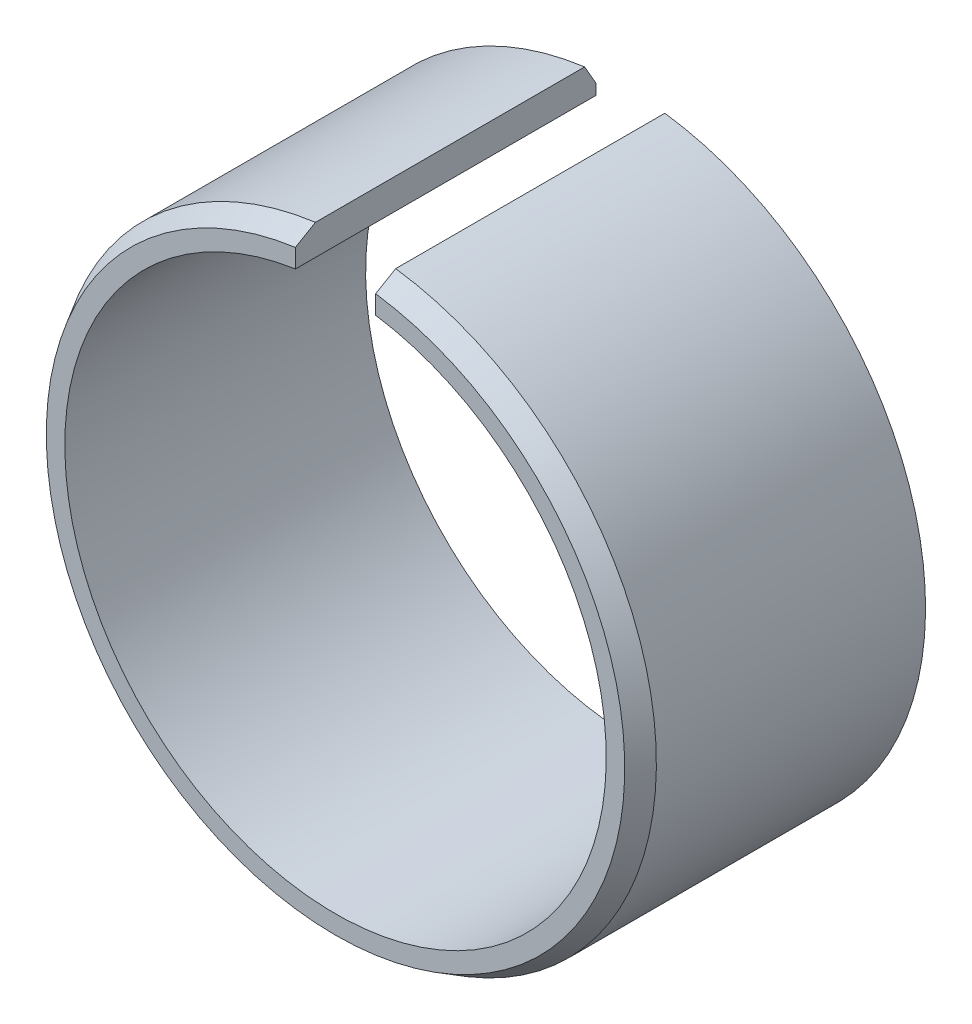
ISO-10303-21;
HEADER;
FILE_DESCRIPTION(('STEP AP214'),'2;1');
FILE_NAME('part.step','',(''),(''),'','','');
FILE_SCHEMA(('AUTOMOTIVE_DESIGN { 1 0 10303 214 1 1 1 1 }'));
ENDSEC;
DATA;
#1=APPLICATION_CONTEXT('core data for automotive mechanical design processes');
#2=APPLICATION_PROTOCOL_DEFINITION('international standard','automotive_design',2000,#1);
#3=PRODUCT_CONTEXT('',#1,'mechanical');
#4=PRODUCT('Part','Part','',(#3));
#5=PRODUCT_RELATED_PRODUCT_CATEGORY('part','',(#4));
#6=PRODUCT_DEFINITION_FORMATION('','',#4);
#7=PRODUCT_DEFINITION_CONTEXT('part definition',#1,'design');
#8=PRODUCT_DEFINITION('design','',#6,#7);
#9=PRODUCT_DEFINITION_SHAPE('','',#8);
#10=(LENGTH_UNIT() NAMED_UNIT(*) SI_UNIT(.MILLI.,.METRE.));
#11=(NAMED_UNIT(*) PLANE_ANGLE_UNIT() SI_UNIT($,.RADIAN.));
#12=(NAMED_UNIT(*) SI_UNIT($,.STERADIAN.) SOLID_ANGLE_UNIT());
#13=UNCERTAINTY_MEASURE_WITH_UNIT(LENGTH_MEASURE(1.E-05),#10,'distance_accuracy_value','');
#14=(GEOMETRIC_REPRESENTATION_CONTEXT(3) GLOBAL_UNCERTAINTY_ASSIGNED_CONTEXT((#13)) GLOBAL_UNIT_ASSIGNED_CONTEXT((#10,
#11,#12)) REPRESENTATION_CONTEXT('',''));
#15=CARTESIAN_POINT('',(0.,0.,0.));
#16=DIRECTION('',(0.,0.,1.));
#17=DIRECTION('',(1.,0.,0.));
#18=AXIS2_PLACEMENT_3D('',#15,#16,#17);
#19=CARTESIAN_POINT('',(0.,0.,15.));
#20=DIRECTION('',(0.,0.,-1.));
#21=DIRECTION('',(-1.,0.,0.));
#22=AXIS2_PLACEMENT_3D('',#19,#20,#21);
#23=CYLINDRICAL_SURFACE('',#22,15.);
#24=DIRECTION('',(0.,0.,-1.));
#25=VECTOR('',#24,1.);
#26=CARTESIAN_POINT('',(2.,14.8660687473185,15.));
#27=LINE('',#26,#25);
#28=CARTESIAN_POINT('',(2.,14.8660687473185,14.));
#29=VERTEX_POINT('',#28);
#30=CARTESIAN_POINT('',(2.,14.8660687473185,0.577350269189628));
#31=VERTEX_POINT('',#30);
#32=EDGE_CURVE('E102',#29,#31,#27,.T.);
#33=ORIENTED_EDGE('',*,*,#32,.F.);
#34=CARTESIAN_POINT('',(0.,0.,14.));
#35=DIRECTION('',(0.,0.,1.));
#36=DIRECTION('',(1.,0.,0.));
#37=AXIS2_PLACEMENT_3D('',#34,#35,#36);
#38=CIRCLE('',#37,15.);
#39=CARTESIAN_POINT('',(-2.,14.8660687473185,14.));
#40=VERTEX_POINT('',#39);
#41=EDGE_CURVE('E179',#29,#40,#38,.F.);
#42=ORIENTED_EDGE('',*,*,#41,.T.);
#43=DIRECTION('',(0.,0.,-1.));
#44=VECTOR('',#43,1.);
#45=CARTESIAN_POINT('',(-2.,14.8660687473185,15.));
#46=LINE('',#45,#44);
#47=CARTESIAN_POINT('',(-2.,14.8660687473185,0.577350269189628));
#48=VERTEX_POINT('',#47);
#49=EDGE_CURVE('E116',#40,#48,#46,.T.);
#50=ORIENTED_EDGE('',*,*,#49,.T.);
#51=CARTESIAN_POINT('',(0.,0.,0.577350269189628));
#52=DIRECTION('',(0.,0.,1.));
#53=DIRECTION('',(1.,0.,0.));
#54=AXIS2_PLACEMENT_3D('',#51,#52,#53);
#55=CIRCLE('',#54,15.);
#56=EDGE_CURVE('E181',#48,#31,#55,.T.);
#57=ORIENTED_EDGE('',*,*,#56,.T.);
#58=EDGE_LOOP('',(#33,#42,#50,#57));
#59=FACE_BOUND('',#58,.T.);
#60=ADVANCED_FACE('F34',(#59),#23,.T.);
#61=CARTESIAN_POINT('',(2.,14.8660687473185,15.));
#62=DIRECTION('',(1.,0.,0.));
#63=DIRECTION('',(0.,1.,0.));
#64=AXIS2_PLACEMENT_3D('',#61,#62,#63);
#65=PLANE('',#64);
#66=DIRECTION('',(0.,-1.,0.));
#67=VECTOR('',#66,1.);
#68=CARTESIAN_POINT('',(2.,14.8660687473185,15.));
#69=LINE('',#68,#67);
#70=CARTESIAN_POINT('',(2.,14.2833058238506,15.));
#71=VERTEX_POINT('',#70);
#72=CARTESIAN_POINT('',(2.,13.3510299228187,15.));
#73=VERTEX_POINT('',#72);
#74=EDGE_CURVE('E108',#71,#73,#69,.T.);
#75=ORIENTED_EDGE('',*,*,#74,.F.);
#76=CARTESIAN_POINT('',(2.,14.2833058238506,15.));
#77=CARTESIAN_POINT('',(2.,14.3804597787461,14.8333489519249));
#78=CARTESIAN_POINT('',(2.,14.4776003331556,14.6666900945434));
#79=CARTESIAN_POINT('',(2.,14.6718546409783,14.3333567612101));
#80=CARTESIAN_POINT('',(2.,14.7689683943913,14.1666822852582));
#81=CARTESIAN_POINT('',(2.,14.8660687473185,14.));
#82=B_SPLINE_CURVE_WITH_KNOTS('',3,(#76,#77,#78,#79,#80,#81),.UNSPECIFIED.,.F.,.F.,(4,2,4),(0.,
0.578708180771812,1.1574163613968),.UNSPECIFIED.);
#83=EDGE_CURVE('E130',#71,#29,#82,.T.);
#84=ORIENTED_EDGE('',*,*,#83,.T.);
#85=ORIENTED_EDGE('',*,*,#32,.T.);
#86=CARTESIAN_POINT('',(2.,14.8660687473185,0.577350269189628));
#87=CARTESIAN_POINT('',(2.,14.6978194642791,0.481076669979314));
#88=CARTESIAN_POINT('',(2.,14.5295562989225,0.384827347976202));
#89=CARTESIAN_POINT('',(2.,14.1930022033334,0.192377258246257));
#90=CARTESIAN_POINT('',(2.,14.0247112731008,0.0961764905194929));
#91=CARTESIAN_POINT('',(2.,13.856406460551,0.));
#92=B_SPLINE_CURVE_WITH_KNOTS('',3,(#86,#87,#88,#89,#90,#91),.UNSPECIFIED.,.F.,.F.,(4,2,4),(0.,
0.581539184592871,1.16307837002051),.UNSPECIFIED.);
#93=CARTESIAN_POINT('',(2.,13.856406460551,0.));
#94=VERTEX_POINT('',#93);
#95=EDGE_CURVE('E93',#31,#94,#92,.T.);
#96=ORIENTED_EDGE('',*,*,#95,.T.);
#97=DIRECTION('',(0.,-1.,0.));
#98=VECTOR('',#97,1.);
#99=CARTESIAN_POINT('',(2.,14.8660687473185,0.));
#100=LINE('',#99,#98);
#101=CARTESIAN_POINT('',(2.,13.3510299228187,0.));
#102=VERTEX_POINT('',#101);
#103=EDGE_CURVE('E86',#94,#102,#100,.T.);
#104=ORIENTED_EDGE('',*,*,#103,.T.);
#105=DIRECTION('',(0.,0.,-1.));
#106=VECTOR('',#105,1.);
#107=CARTESIAN_POINT('',(2.,13.3510299228187,15.));
#108=LINE('',#107,#106);
#109=EDGE_CURVE('E90',#73,#102,#108,.T.);
#110=ORIENTED_EDGE('',*,*,#109,.F.);
#111=EDGE_LOOP('',(#75,#84,#85,#96,#104,#110));
#112=FACE_BOUND('',#111,.T.);
#113=ADVANCED_FACE('F89',(#112),#65,.F.);
#114=CARTESIAN_POINT('',(0.,0.,15.));
#115=DIRECTION('',(0.,0.,-1.));
#116=DIRECTION('',(-1.,0.,0.));
#117=AXIS2_PLACEMENT_3D('',#114,#115,#116);
#118=CYLINDRICAL_SURFACE('',#117,13.5);
#119=CARTESIAN_POINT('',(0.,0.,0.));
#120=DIRECTION('',(0.,0.,-1.));
#121=DIRECTION('',(1.,0.,0.));
#122=AXIS2_PLACEMENT_3D('',#119,#120,#121);
#123=CIRCLE('',#122,13.5);
#124=CARTESIAN_POINT('',(-2.,13.3510299228187,0.));
#125=VERTEX_POINT('',#124);
#126=EDGE_CURVE('E95',#102,#125,#123,.T.);
#127=ORIENTED_EDGE('',*,*,#126,.T.);
#128=DIRECTION('',(0.,0.,-1.));
#129=VECTOR('',#128,1.);
#130=CARTESIAN_POINT('',(-2.,13.3510299228187,15.));
#131=LINE('',#130,#129);
#132=CARTESIAN_POINT('',(-2.,13.3510299228187,15.));
#133=VERTEX_POINT('',#132);
#134=EDGE_CURVE('E103',#133,#125,#131,.T.);
#135=ORIENTED_EDGE('',*,*,#134,.F.);
#136=CARTESIAN_POINT('',(0.,0.,15.));
#137=DIRECTION('',(0.,0.,-1.));
#138=DIRECTION('',(1.,0.,0.));
#139=AXIS2_PLACEMENT_3D('',#136,#137,#138);
#140=CIRCLE('',#139,13.5);
#141=EDGE_CURVE('E101',#73,#133,#140,.T.);
#142=ORIENTED_EDGE('',*,*,#141,.F.);
#143=ORIENTED_EDGE('',*,*,#109,.T.);
#144=EDGE_LOOP('',(#127,#135,#142,#143));
#145=FACE_BOUND('',#144,.T.);
#146=ADVANCED_FACE('F98',(#145),#118,.F.);
#147=CARTESIAN_POINT('',(-2.,14.8660687473185,15.));
#148=DIRECTION('',(-1.,0.,0.));
#149=DIRECTION('',(0.,-1.,0.));
#150=AXIS2_PLACEMENT_3D('',#147,#148,#149);
#151=PLANE('',#150);
#152=ORIENTED_EDGE('',*,*,#49,.F.);
#153=CARTESIAN_POINT('',(-2.,14.8660687473185,14.));
#154=CARTESIAN_POINT('',(-2.,14.7689683943913,14.1666822852582));
#155=CARTESIAN_POINT('',(-2.,14.6718546409783,14.3333567612101));
#156=CARTESIAN_POINT('',(-2.,14.4776003331556,14.6666900945434));
#157=CARTESIAN_POINT('',(-2.,14.3804597787461,14.8333489519249));
#158=CARTESIAN_POINT('',(-2.,14.2833058238506,15.));
#159=B_SPLINE_CURVE_WITH_KNOTS('',3,(#153,#154,#155,#156,#157,#158),.UNSPECIFIED.,.F.,.F.,(4,2,
4),(0.,0.578708180624988,1.1574163613968),.UNSPECIFIED.);
#160=CARTESIAN_POINT('',(-2.,14.2833058238506,15.));
#161=VERTEX_POINT('',#160);
#162=EDGE_CURVE('E41',#40,#161,#159,.T.);
#163=ORIENTED_EDGE('',*,*,#162,.T.);
#164=DIRECTION('',(0.,1.,0.));
#165=VECTOR('',#164,1.);
#166=CARTESIAN_POINT('',(-2.,14.8660687473185,15.));
#167=LINE('',#166,#165);
#168=EDGE_CURVE('E113',#133,#161,#167,.T.);
#169=ORIENTED_EDGE('',*,*,#168,.F.);
#170=ORIENTED_EDGE('',*,*,#134,.T.);
#171=DIRECTION('',(0.,1.,0.));
#172=VECTOR('',#171,1.);
#173=CARTESIAN_POINT('',(-2.,14.8660687473185,0.));
#174=LINE('',#173,#172);
#175=CARTESIAN_POINT('',(-2.,13.856406460551,0.));
#176=VERTEX_POINT('',#175);
#177=EDGE_CURVE('E106',#125,#176,#174,.T.);
#178=ORIENTED_EDGE('',*,*,#177,.T.);
#179=CARTESIAN_POINT('',(-2.,13.856406460551,0.));
#180=CARTESIAN_POINT('',(-2.,14.0247112731008,0.0961764905194925));
#181=CARTESIAN_POINT('',(-2.,14.1930022033334,0.192377258246257));
#182=CARTESIAN_POINT('',(-2.,14.5295562989225,0.384827347976202));
#183=CARTESIAN_POINT('',(-2.,14.6978194642791,0.481076669979314));
#184=CARTESIAN_POINT('',(-2.,14.8660687473185,0.577350269189628));
#185=B_SPLINE_CURVE_WITH_KNOTS('',3,(#179,#180,#181,#182,#183,#184),.UNSPECIFIED.,.F.,.F.,(4,2,
4),(0.,0.581539185427638,1.16307837002051),.UNSPECIFIED.);
#186=EDGE_CURVE('E53',#176,#48,#185,.T.);
#187=ORIENTED_EDGE('',*,*,#186,.T.);
#188=EDGE_LOOP('',(#152,#163,#169,#170,#178,#187));
#189=FACE_BOUND('',#188,.T.);
#190=ADVANCED_FACE('F145',(#189),#151,.F.);
#191=CARTESIAN_POINT('',(0.,0.,15.));
#192=DIRECTION('',(0.,0.,1.));
#193=DIRECTION('',(1.,0.,0.));
#194=AXIS2_PLACEMENT_3D('',#191,#192,#193);
#195=PLANE('',#194);
#196=ORIENTED_EDGE('',*,*,#168,.T.);
#197=CARTESIAN_POINT('',(0.,0.,15.));
#198=DIRECTION('',(0.,0.,1.));
#199=DIRECTION('',(1.,0.,0.));
#200=AXIS2_PLACEMENT_3D('',#197,#198,#199);
#201=CIRCLE('',#200,14.4226497308104);
#202=EDGE_CURVE('E121',#161,#71,#201,.T.);
#203=ORIENTED_EDGE('',*,*,#202,.T.);
#204=ORIENTED_EDGE('',*,*,#74,.T.);
#205=ORIENTED_EDGE('',*,*,#141,.T.);
#206=EDGE_LOOP('',(#196,#203,#204,#205));
#207=FACE_BOUND('',#206,.T.);
#208=ADVANCED_FACE('F149',(#207),#195,.T.);
#209=CARTESIAN_POINT('',(0.,0.,0.));
#210=DIRECTION('',(0.,0.,1.));
#211=DIRECTION('',(1.,0.,0.));
#212=AXIS2_PLACEMENT_3D('',#209,#210,#211);
#213=PLANE('',#212);
#214=ORIENTED_EDGE('',*,*,#103,.F.);
#215=CARTESIAN_POINT('',(0.,0.,0.));
#216=DIRECTION('',(0.,0.,1.));
#217=DIRECTION('',(1.,0.,0.));
#218=AXIS2_PLACEMENT_3D('',#215,#216,#217);
#219=CIRCLE('',#218,14.);
#220=EDGE_CURVE('E11',#94,#176,#219,.F.);
#221=ORIENTED_EDGE('',*,*,#220,.T.);
#222=ORIENTED_EDGE('',*,*,#177,.F.);
#223=ORIENTED_EDGE('',*,*,#126,.F.);
#224=EDGE_LOOP('',(#214,#221,#222,#223));
#225=FACE_BOUND('',#224,.T.);
#226=ADVANCED_FACE('F105',(#225),#213,.F.);
#227=CARTESIAN_POINT('',(0.,0.,15.));
#228=DIRECTION('',(0.,0.,-1.));
#229=DIRECTION('',(-1.,0.,0.));
#230=AXIS2_PLACEMENT_3D('',#227,#228,#229);
#231=CONICAL_SURFACE('',#230,14.4226497308104,0.523598775598295);
#232=ORIENTED_EDGE('',*,*,#162,.F.);
#233=ORIENTED_EDGE('',*,*,#41,.F.);
#234=ORIENTED_EDGE('',*,*,#83,.F.);
#235=ORIENTED_EDGE('',*,*,#202,.F.);
#236=EDGE_LOOP('',(#232,#233,#234,#235));
#237=FACE_BOUND('',#236,.T.);
#238=ADVANCED_FACE('F162',(#237),#231,.T.);
#239=CARTESIAN_POINT('',(0.,0.,0.577350269189628));
#240=DIRECTION('',(0.,0.,1.));
#241=DIRECTION('',(1.,0.,0.));
#242=AXIS2_PLACEMENT_3D('',#239,#240,#241);
#243=CONICAL_SURFACE('',#242,15.,1.0471975511966);
#244=ORIENTED_EDGE('',*,*,#186,.F.);
#245=ORIENTED_EDGE('',*,*,#220,.F.);
#246=ORIENTED_EDGE('',*,*,#95,.F.);
#247=ORIENTED_EDGE('',*,*,#56,.F.);
#248=EDGE_LOOP('',(#244,#245,#246,#247));
#249=FACE_BOUND('',#248,.T.);
#250=ADVANCED_FACE('F137',(#249),#243,.T.);
#251=CLOSED_SHELL('',(#60,#113,#146,#190,#208,#226,#238,#250));
#252=MANIFOLD_SOLID_BREP('B2',#251);
#253=ADVANCED_BREP_SHAPE_REPRESENTATION('',(#18,#252),#14);
#254=SHAPE_DEFINITION_REPRESENTATION(#9,#253);
ENDSEC;
END-ISO-10303-21;
